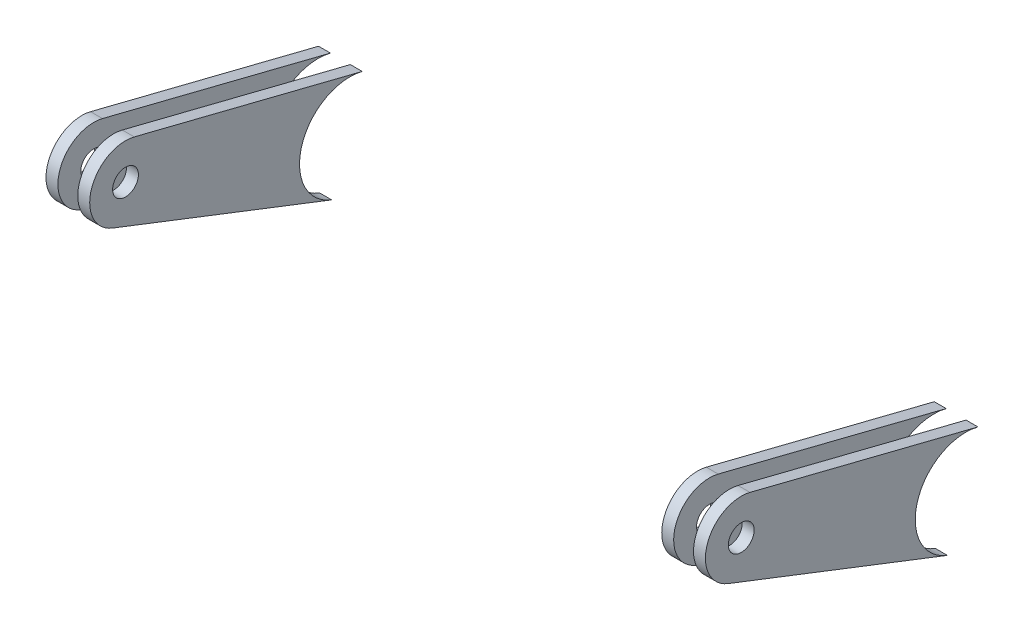
ISO-10303-21;
HEADER;
FILE_DESCRIPTION(('STEP AP214'),'2;1');
FILE_NAME('part.step','',(''),(''),'','','');
FILE_SCHEMA(('AUTOMOTIVE_DESIGN { 1 0 10303 214 1 1 1 1 }'));
ENDSEC;
DATA;
#1=APPLICATION_CONTEXT('core data for automotive mechanical design processes');
#2=APPLICATION_PROTOCOL_DEFINITION('international standard','automotive_design',2000,#1);
#3=PRODUCT_CONTEXT('',#1,'mechanical');
#4=PRODUCT('Part','Part','',(#3));
#5=PRODUCT_RELATED_PRODUCT_CATEGORY('part','',(#4));
#6=PRODUCT_DEFINITION_FORMATION('','',#4);
#7=PRODUCT_DEFINITION_CONTEXT('part definition',#1,'design');
#8=PRODUCT_DEFINITION('design','',#6,#7);
#9=PRODUCT_DEFINITION_SHAPE('','',#8);
#10=(LENGTH_UNIT() NAMED_UNIT(*) SI_UNIT(.MILLI.,.METRE.));
#11=(NAMED_UNIT(*) PLANE_ANGLE_UNIT() SI_UNIT($,.RADIAN.));
#12=(NAMED_UNIT(*) SI_UNIT($,.STERADIAN.) SOLID_ANGLE_UNIT());
#13=UNCERTAINTY_MEASURE_WITH_UNIT(LENGTH_MEASURE(1.E-05),#10,'distance_accuracy_value','');
#14=(GEOMETRIC_REPRESENTATION_CONTEXT(3) GLOBAL_UNCERTAINTY_ASSIGNED_CONTEXT((#13)) GLOBAL_UNIT_ASSIGNED_CONTEXT((#10,
#11,#12)) REPRESENTATION_CONTEXT('',''));
#15=CARTESIAN_POINT('',(0.,0.,0.));
#16=DIRECTION('',(0.,0.,1.));
#17=DIRECTION('',(1.,0.,0.));
#18=AXIS2_PLACEMENT_3D('',#15,#16,#17);
#19=CARTESIAN_POINT('',(-87.9999999999965,265.000000000002,-2250.));
#20=DIRECTION('',(-1.,0.,0.));
#21=DIRECTION('',(0.,-1.,0.));
#22=AXIS2_PLACEMENT_3D('',#19,#20,#21);
#23=PLANE('',#22);
#24=CARTESIAN_POINT('',(-87.9999999999966,283.000000000003,-2193.5));
#25=DIRECTION('',(1.,0.,0.));
#26=DIRECTION('',(0.,1.,0.));
#27=AXIS2_PLACEMENT_3D('',#24,#25,#26);
#28=CIRCLE('',#27,3.25000000000017);
#29=CARTESIAN_POINT('',(-87.9999999999966,286.250000000003,-2193.5));
#30=VERTEX_POINT('',#29);
#31=EDGE_CURVE('E118',#30,#30,#28,.T.);
#32=ORIENTED_EDGE('',*,*,#31,.T.);
#33=EDGE_LOOP('',(#32));
#34=FACE_BOUND('',#33,.T.);
#35=DIRECTION('',(0.,0.243792880775434,0.969827320342758));
#36=VECTOR('',#35,1.);
#37=CARTESIAN_POINT('',(-87.9999999999965,277.316806968356,-2253.09616958585));
#38=LINE('',#37,#36);
#39=CARTESIAN_POINT('',(-87.9999999999965,277.316806968356,-2253.09616958585));
#40=VERTEX_POINT('',#39);
#41=CARTESIAN_POINT('',(-87.9999999999966,291.745326695139,-2195.69837938529));
#42=VERTEX_POINT('',#41);
#43=EDGE_CURVE('E93',#40,#42,#38,.T.);
#44=ORIENTED_EDGE('',*,*,#43,.F.);
#45=CARTESIAN_POINT('',(-87.9999999999965,265.000000000002,-2250.));
#46=DIRECTION('',(-1.,0.,0.));
#47=DIRECTION('',(0.,-1.,0.));
#48=AXIS2_PLACEMENT_3D('',#45,#46,#47);
#49=CIRCLE('',#48,12.7);
#50=CARTESIAN_POINT('',(-87.9999999999966,253.162021891337,-2245.4008398268));
#51=VERTEX_POINT('',#50);
#52=EDGE_CURVE('E49',#40,#51,#49,.F.);
#53=ORIENTED_EDGE('',*,*,#52,.T.);
#54=DIRECTION('',(0.,-0.362138596315164,-0.932124260524788));
#55=VECTOR('',#54,1.);
#56=CARTESIAN_POINT('',(-87.9999999999966,253.162021891337,-2245.4008398268));
#57=LINE('',#56,#55);
#58=CARTESIAN_POINT('',(-87.9999999999966,274.594657102599,-2190.23444924961));
#59=VERTEX_POINT('',#58);
#60=EDGE_CURVE('E106',#59,#51,#57,.T.);
#61=ORIENTED_EDGE('',*,*,#60,.F.);
#62=CARTESIAN_POINT('',(-87.9999999999966,283.000000000003,-2193.5));
#63=DIRECTION('',(1.,0.,0.));
#64=DIRECTION('',(0.,1.,0.));
#65=AXIS2_PLACEMENT_3D('',#62,#63,#64);
#66=CIRCLE('',#65,9.01740599764169);
#67=EDGE_CURVE('E88',#42,#59,#66,.T.);
#68=ORIENTED_EDGE('',*,*,#67,.F.);
#69=EDGE_LOOP('',(#44,#53,#61,#68));
#70=FACE_BOUND('',#69,.T.);
#71=ADVANCED_FACE('F46',(#34,#70),#23,.T.);
#72=CARTESIAN_POINT('',(-84.9999999999965,265.000000000002,-2250.));
#73=DIRECTION('',(-1.,0.,0.));
#74=DIRECTION('',(0.,-1.,0.));
#75=AXIS2_PLACEMENT_3D('',#72,#73,#74);
#76=PLANE('',#75);
#77=CARTESIAN_POINT('',(-84.9999999999966,283.000000000003,-2193.5));
#78=DIRECTION('',(1.,0.,0.));
#79=DIRECTION('',(0.,1.,0.));
#80=AXIS2_PLACEMENT_3D('',#77,#78,#79);
#81=CIRCLE('',#80,3.25000000000017);
#82=CARTESIAN_POINT('',(-84.9999999999966,286.250000000003,-2193.5));
#83=VERTEX_POINT('',#82);
#84=EDGE_CURVE('E116',#83,#83,#81,.T.);
#85=ORIENTED_EDGE('',*,*,#84,.F.);
#86=EDGE_LOOP('',(#85));
#87=FACE_BOUND('',#86,.T.);
#88=CARTESIAN_POINT('',(-84.9999999999965,265.000000000002,-2250.));
#89=DIRECTION('',(-1.,0.,0.));
#90=DIRECTION('',(0.,-1.,0.));
#91=AXIS2_PLACEMENT_3D('',#88,#89,#90);
#92=CIRCLE('',#91,12.7);
#93=CARTESIAN_POINT('',(-84.9999999999965,277.316806968356,-2253.09616958585));
#94=VERTEX_POINT('',#93);
#95=CARTESIAN_POINT('',(-84.9999999999966,253.162021891337,-2245.4008398268));
#96=VERTEX_POINT('',#95);
#97=EDGE_CURVE('E12',#94,#96,#92,.F.);
#98=ORIENTED_EDGE('',*,*,#97,.F.);
#99=DIRECTION('',(0.,0.243792880775434,0.969827320342758));
#100=VECTOR('',#99,1.);
#101=CARTESIAN_POINT('',(-84.9999999999965,277.316806968356,-2253.09616958585));
#102=LINE('',#101,#100);
#103=CARTESIAN_POINT('',(-84.9999999999966,291.745326695139,-2195.69837938529));
#104=VERTEX_POINT('',#103);
#105=EDGE_CURVE('E101',#94,#104,#102,.T.);
#106=ORIENTED_EDGE('',*,*,#105,.T.);
#107=CARTESIAN_POINT('',(-84.9999999999966,283.000000000003,-2193.5));
#108=DIRECTION('',(1.,0.,0.));
#109=DIRECTION('',(0.,1.,0.));
#110=AXIS2_PLACEMENT_3D('',#107,#108,#109);
#111=CIRCLE('',#110,9.01740599764169);
#112=CARTESIAN_POINT('',(-84.9999999999966,274.594657102599,-2190.23444924961));
#113=VERTEX_POINT('',#112);
#114=EDGE_CURVE('E85',#104,#113,#111,.T.);
#115=ORIENTED_EDGE('',*,*,#114,.T.);
#116=DIRECTION('',(0.,-0.362138596315164,-0.932124260524788));
#117=VECTOR('',#116,1.);
#118=CARTESIAN_POINT('',(-84.9999999999966,253.162021891337,-2245.4008398268));
#119=LINE('',#118,#117);
#120=EDGE_CURVE('E99',#113,#96,#119,.T.);
#121=ORIENTED_EDGE('',*,*,#120,.T.);
#122=EDGE_LOOP('',(#98,#106,#115,#121));
#123=FACE_BOUND('',#122,.T.);
#124=ADVANCED_FACE('F98',(#87,#123),#76,.F.);
#125=CARTESIAN_POINT('',(-87.9999999999966,253.162021891337,-2245.4008398268));
#126=DIRECTION('',(0.,-0.932124260524788,0.362138596315164));
#127=DIRECTION('',(0.,-0.362138596315164,-0.932124260524788));
#128=AXIS2_PLACEMENT_3D('',#125,#126,#127);
#129=PLANE('',#128);
#130=ORIENTED_EDGE('',*,*,#120,.F.);
#131=DIRECTION('',(1.,0.,0.));
#132=VECTOR('',#131,1.);
#133=CARTESIAN_POINT('',(-87.9999999999966,274.594657102599,-2190.23444924961));
#134=LINE('',#133,#132);
#135=EDGE_CURVE('E82',#59,#113,#134,.T.);
#136=ORIENTED_EDGE('',*,*,#135,.F.);
#137=ORIENTED_EDGE('',*,*,#60,.T.);
#138=DIRECTION('',(1.,0.,0.));
#139=VECTOR('',#138,1.);
#140=CARTESIAN_POINT('',(-87.9999999999966,253.162021891337,-2245.4008398268));
#141=LINE('',#140,#139);
#142=EDGE_CURVE('E105',#51,#96,#141,.T.);
#143=ORIENTED_EDGE('',*,*,#142,.T.);
#144=EDGE_LOOP('',(#130,#136,#137,#143));
#145=FACE_BOUND('',#144,.T.);
#146=ADVANCED_FACE('F104',(#145),#129,.T.);
#147=CARTESIAN_POINT('',(-87.9999999999966,283.000000000003,-2193.5));
#148=DIRECTION('',(1.,0.,0.));
#149=DIRECTION('',(0.,1.,0.));
#150=AXIS2_PLACEMENT_3D('',#147,#148,#149);
#151=CYLINDRICAL_SURFACE('',#150,9.01740599764169);
#152=ORIENTED_EDGE('',*,*,#114,.F.);
#153=DIRECTION('',(1.,0.,0.));
#154=VECTOR('',#153,1.);
#155=CARTESIAN_POINT('',(-87.9999999999966,291.745326695139,-2195.69837938529));
#156=LINE('',#155,#154);
#157=EDGE_CURVE('E115',#42,#104,#156,.T.);
#158=ORIENTED_EDGE('',*,*,#157,.F.);
#159=ORIENTED_EDGE('',*,*,#67,.T.);
#160=ORIENTED_EDGE('',*,*,#135,.T.);
#161=EDGE_LOOP('',(#152,#158,#159,#160));
#162=FACE_BOUND('',#161,.T.);
#163=ADVANCED_FACE('F84',(#162),#151,.T.);
#164=CARTESIAN_POINT('',(-87.9999999999965,277.316806968356,-2253.09616958585));
#165=DIRECTION('',(0.,0.969827320342758,-0.243792880775434));
#166=DIRECTION('',(0.,0.243792880775434,0.969827320342758));
#167=AXIS2_PLACEMENT_3D('',#164,#165,#166);
#168=PLANE('',#167);
#169=ORIENTED_EDGE('',*,*,#105,.F.);
#170=DIRECTION('',(1.,0.,0.));
#171=VECTOR('',#170,1.);
#172=CARTESIAN_POINT('',(-87.9999999999965,277.316806968356,-2253.09616958585));
#173=LINE('',#172,#171);
#174=EDGE_CURVE('E55',#40,#94,#173,.T.);
#175=ORIENTED_EDGE('',*,*,#174,.F.);
#176=ORIENTED_EDGE('',*,*,#43,.T.);
#177=ORIENTED_EDGE('',*,*,#157,.T.);
#178=EDGE_LOOP('',(#169,#175,#176,#177));
#179=FACE_BOUND('',#178,.T.);
#180=ADVANCED_FACE('F125',(#179),#168,.T.);
#181=CARTESIAN_POINT('',(-87.9999999999966,283.000000000003,-2193.5));
#182=DIRECTION('',(1.,0.,0.));
#183=DIRECTION('',(0.,1.,0.));
#184=AXIS2_PLACEMENT_3D('',#181,#182,#183);
#185=CYLINDRICAL_SURFACE('',#184,3.25000000000017);
#186=ORIENTED_EDGE('',*,*,#31,.F.);
#187=EDGE_LOOP('',(#186));
#188=FACE_BOUND('',#187,.T.);
#189=ORIENTED_EDGE('',*,*,#84,.T.);
#190=EDGE_LOOP('',(#189));
#191=FACE_BOUND('',#190,.T.);
#192=ADVANCED_FACE('F130',(#188,#191),#185,.F.);
#193=CARTESIAN_POINT('',(-220.,265.000000000002,-2250.));
#194=DIRECTION('',(1.,0.,0.));
#195=DIRECTION('',(0.,0.,-1.));
#196=AXIS2_PLACEMENT_3D('',#193,#194,#195);
#197=CYLINDRICAL_SURFACE('',#196,12.7);
#198=ORIENTED_EDGE('',*,*,#174,.T.);
#199=ORIENTED_EDGE('',*,*,#97,.T.);
#200=ORIENTED_EDGE('',*,*,#142,.F.);
#201=ORIENTED_EDGE('',*,*,#52,.F.);
#202=EDGE_LOOP('',(#198,#199,#200,#201));
#203=FACE_BOUND('',#202,.T.);
#204=ADVANCED_FACE('F128',(#203),#197,.F.);
#205=CLOSED_SHELL('',(#71,#124,#146,#163,#180,#192,#204));
#206=MANIFOLD_SOLID_BREP('B2',#205);
#207=CARTESIAN_POINT('',(-76.9999999999965,265.000000000002,-2250.));
#208=DIRECTION('',(-1.,0.,0.));
#209=DIRECTION('',(0.,-1.,0.));
#210=AXIS2_PLACEMENT_3D('',#207,#208,#209);
#211=PLANE('',#210);
#212=CARTESIAN_POINT('',(-76.9999999999966,283.000000000003,-2193.5));
#213=DIRECTION('',(1.,0.,0.));
#214=DIRECTION('',(0.,1.,0.));
#215=AXIS2_PLACEMENT_3D('',#212,#213,#214);
#216=CIRCLE('',#215,3.25000000000017);
#217=CARTESIAN_POINT('',(-76.9999999999966,286.250000000003,-2193.5));
#218=VERTEX_POINT('',#217);
#219=EDGE_CURVE('E260',#218,#218,#216,.T.);
#220=ORIENTED_EDGE('',*,*,#219,.F.);
#221=EDGE_LOOP('',(#220));
#222=FACE_BOUND('',#221,.T.);
#223=CARTESIAN_POINT('',(-76.9999999999965,265.000000000002,-2250.));
#224=DIRECTION('',(-1.,0.,0.));
#225=DIRECTION('',(0.,-1.,0.));
#226=AXIS2_PLACEMENT_3D('',#223,#224,#225);
#227=CIRCLE('',#226,12.7);
#228=CARTESIAN_POINT('',(-76.9999999999965,277.316806968356,-2253.09616958585));
#229=VERTEX_POINT('',#228);
#230=CARTESIAN_POINT('',(-76.9999999999966,253.162021891337,-2245.4008398268));
#231=VERTEX_POINT('',#230);
#232=EDGE_CURVE('E212',#229,#231,#227,.F.);
#233=ORIENTED_EDGE('',*,*,#232,.F.);
#234=DIRECTION('',(0.,0.243792880775434,0.969827320342758));
#235=VECTOR('',#234,1.);
#236=CARTESIAN_POINT('',(-76.9999999999965,277.316806968356,-2253.09616958585));
#237=LINE('',#236,#235);
#238=CARTESIAN_POINT('',(-76.9999999999966,291.745326695138,-2195.69837938529));
#239=VERTEX_POINT('',#238);
#240=EDGE_CURVE('E273',#229,#239,#237,.T.);
#241=ORIENTED_EDGE('',*,*,#240,.T.);
#242=CARTESIAN_POINT('',(-76.9999999999966,283.000000000003,-2193.5));
#243=DIRECTION('',(1.,0.,0.));
#244=DIRECTION('',(0.,1.,0.));
#245=AXIS2_PLACEMENT_3D('',#242,#243,#244);
#246=CIRCLE('',#245,9.01740599764169);
#247=CARTESIAN_POINT('',(-76.9999999999966,274.594657102599,-2190.23444924961));
#248=VERTEX_POINT('',#247);
#249=EDGE_CURVE('E271',#239,#248,#246,.T.);
#250=ORIENTED_EDGE('',*,*,#249,.T.);
#251=DIRECTION('',(0.,-0.362138596315164,-0.932124260524788));
#252=VECTOR('',#251,1.);
#253=CARTESIAN_POINT('',(-76.9999999999966,253.162021891337,-2245.4008398268));
#254=LINE('',#253,#252);
#255=EDGE_CURVE('E259',#248,#231,#254,.T.);
#256=ORIENTED_EDGE('',*,*,#255,.T.);
#257=EDGE_LOOP('',(#233,#241,#250,#256));
#258=FACE_BOUND('',#257,.T.);
#259=ADVANCED_FACE('F203',(#222,#258),#211,.F.);
#260=CARTESIAN_POINT('',(-79.9999999999965,265.000000000002,-2250.));
#261=DIRECTION('',(-1.,0.,0.));
#262=DIRECTION('',(0.,-1.,0.));
#263=AXIS2_PLACEMENT_3D('',#260,#261,#262);
#264=PLANE('',#263);
#265=CARTESIAN_POINT('',(-79.9999999999966,283.000000000003,-2193.5));
#266=DIRECTION('',(1.,0.,0.));
#267=DIRECTION('',(0.,1.,0.));
#268=AXIS2_PLACEMENT_3D('',#265,#266,#267);
#269=CIRCLE('',#268,3.25000000000017);
#270=CARTESIAN_POINT('',(-79.9999999999966,286.250000000003,-2193.5));
#271=VERTEX_POINT('',#270);
#272=EDGE_CURVE('E270',#271,#271,#269,.T.);
#273=ORIENTED_EDGE('',*,*,#272,.T.);
#274=EDGE_LOOP('',(#273));
#275=FACE_BOUND('',#274,.T.);
#276=DIRECTION('',(0.,0.243792880775434,0.969827320342758));
#277=VECTOR('',#276,1.);
#278=CARTESIAN_POINT('',(-79.9999999999965,277.316806968356,-2253.09616958585));
#279=LINE('',#278,#277);
#280=CARTESIAN_POINT('',(-79.9999999999965,277.316806968356,-2253.09616958585));
#281=VERTEX_POINT('',#280);
#282=CARTESIAN_POINT('',(-79.9999999999966,291.745326695138,-2195.69837938529));
#283=VERTEX_POINT('',#282);
#284=EDGE_CURVE('E267',#281,#283,#279,.T.);
#285=ORIENTED_EDGE('',*,*,#284,.F.);
#286=CARTESIAN_POINT('',(-79.9999999999965,265.000000000002,-2250.));
#287=DIRECTION('',(-1.,0.,0.));
#288=DIRECTION('',(0.,-1.,0.));
#289=AXIS2_PLACEMENT_3D('',#286,#287,#288);
#290=CIRCLE('',#289,12.7);
#291=CARTESIAN_POINT('',(-79.9999999999966,253.162021891337,-2245.4008398268));
#292=VERTEX_POINT('',#291);
#293=EDGE_CURVE('E206',#281,#292,#290,.F.);
#294=ORIENTED_EDGE('',*,*,#293,.T.);
#295=DIRECTION('',(0.,-0.362138596315164,-0.932124260524788));
#296=VECTOR('',#295,1.);
#297=CARTESIAN_POINT('',(-79.9999999999966,253.162021891337,-2245.4008398268));
#298=LINE('',#297,#296);
#299=CARTESIAN_POINT('',(-79.9999999999966,274.594657102599,-2190.23444924961));
#300=VERTEX_POINT('',#299);
#301=EDGE_CURVE('E257',#300,#292,#298,.T.);
#302=ORIENTED_EDGE('',*,*,#301,.F.);
#303=CARTESIAN_POINT('',(-79.9999999999966,283.000000000003,-2193.5));
#304=DIRECTION('',(1.,0.,0.));
#305=DIRECTION('',(0.,1.,0.));
#306=AXIS2_PLACEMENT_3D('',#303,#304,#305);
#307=CIRCLE('',#306,9.01740599764169);
#308=EDGE_CURVE('E241',#283,#300,#307,.T.);
#309=ORIENTED_EDGE('',*,*,#308,.F.);
#310=EDGE_LOOP('',(#285,#294,#302,#309));
#311=FACE_BOUND('',#310,.T.);
#312=ADVANCED_FACE('F263',(#275,#311),#264,.T.);
#313=CARTESIAN_POINT('',(-76.9999999999965,277.316806968356,-2253.09616958585));
#314=DIRECTION('',(0.,-0.969827320342758,0.243792880775434));
#315=DIRECTION('',(0.,-0.243792880775434,-0.969827320342758));
#316=AXIS2_PLACEMENT_3D('',#313,#314,#315);
#317=PLANE('',#316);
#318=ORIENTED_EDGE('',*,*,#284,.T.);
#319=DIRECTION('',(-1.,0.,0.));
#320=VECTOR('',#319,1.);
#321=CARTESIAN_POINT('',(-76.9999999999966,291.745326695138,-2195.69837938529));
#322=LINE('',#321,#320);
#323=EDGE_CURVE('E248',#239,#283,#322,.T.);
#324=ORIENTED_EDGE('',*,*,#323,.F.);
#325=ORIENTED_EDGE('',*,*,#240,.F.);
#326=DIRECTION('',(-1.,0.,0.));
#327=VECTOR('',#326,1.);
#328=CARTESIAN_POINT('',(-76.9999999999965,277.316806968356,-2253.09616958585));
#329=LINE('',#328,#327);
#330=EDGE_CURVE('E220',#229,#281,#329,.T.);
#331=ORIENTED_EDGE('',*,*,#330,.T.);
#332=EDGE_LOOP('',(#318,#324,#325,#331));
#333=FACE_BOUND('',#332,.T.);
#334=ADVANCED_FACE('F282',(#333),#317,.F.);
#335=CARTESIAN_POINT('',(-76.9999999999966,283.000000000003,-2193.5));
#336=DIRECTION('',(-1.,0.,0.));
#337=DIRECTION('',(0.,-1.,0.));
#338=AXIS2_PLACEMENT_3D('',#335,#336,#337);
#339=CYLINDRICAL_SURFACE('',#338,9.01740599764169);
#340=ORIENTED_EDGE('',*,*,#308,.T.);
#341=DIRECTION('',(-1.,0.,0.));
#342=VECTOR('',#341,1.);
#343=CARTESIAN_POINT('',(-76.9999999999966,274.594657102599,-2190.23444924961));
#344=LINE('',#343,#342);
#345=EDGE_CURVE('E245',#248,#300,#344,.T.);
#346=ORIENTED_EDGE('',*,*,#345,.F.);
#347=ORIENTED_EDGE('',*,*,#249,.F.);
#348=ORIENTED_EDGE('',*,*,#323,.T.);
#349=EDGE_LOOP('',(#340,#346,#347,#348));
#350=FACE_BOUND('',#349,.T.);
#351=ADVANCED_FACE('F243',(#350),#339,.T.);
#352=CARTESIAN_POINT('',(-76.9999999999966,253.162021891337,-2245.4008398268));
#353=DIRECTION('',(0.,0.932124260524788,-0.362138596315164));
#354=DIRECTION('',(0.,0.362138596315164,0.932124260524788));
#355=AXIS2_PLACEMENT_3D('',#352,#353,#354);
#356=PLANE('',#355);
#357=ORIENTED_EDGE('',*,*,#301,.T.);
#358=DIRECTION('',(-1.,0.,0.));
#359=VECTOR('',#358,1.);
#360=CARTESIAN_POINT('',(-76.9999999999966,253.162021891337,-2245.4008398268));
#361=LINE('',#360,#359);
#362=EDGE_CURVE('E44',#231,#292,#361,.T.);
#363=ORIENTED_EDGE('',*,*,#362,.F.);
#364=ORIENTED_EDGE('',*,*,#255,.F.);
#365=ORIENTED_EDGE('',*,*,#345,.T.);
#366=EDGE_LOOP('',(#357,#363,#364,#365));
#367=FACE_BOUND('',#366,.T.);
#368=ADVANCED_FACE('F255',(#367),#356,.F.);
#369=CARTESIAN_POINT('',(-76.9999999999966,283.000000000003,-2193.5));
#370=DIRECTION('',(-1.,0.,0.));
#371=DIRECTION('',(0.,-1.,0.));
#372=AXIS2_PLACEMENT_3D('',#369,#370,#371);
#373=CYLINDRICAL_SURFACE('',#372,3.25000000000017);
#374=ORIENTED_EDGE('',*,*,#219,.T.);
#375=EDGE_LOOP('',(#374));
#376=FACE_BOUND('',#375,.T.);
#377=ORIENTED_EDGE('',*,*,#272,.F.);
#378=EDGE_LOOP('',(#377));
#379=FACE_BOUND('',#378,.T.);
#380=ADVANCED_FACE('F298',(#376,#379),#373,.F.);
#381=CARTESIAN_POINT('',(-220.,265.000000000002,-2250.));
#382=DIRECTION('',(1.,0.,0.));
#383=DIRECTION('',(0.,0.,-1.));
#384=AXIS2_PLACEMENT_3D('',#381,#382,#383);
#385=CYLINDRICAL_SURFACE('',#384,12.7);
#386=ORIENTED_EDGE('',*,*,#232,.T.);
#387=ORIENTED_EDGE('',*,*,#362,.T.);
#388=ORIENTED_EDGE('',*,*,#293,.F.);
#389=ORIENTED_EDGE('',*,*,#330,.F.);
#390=EDGE_LOOP('',(#386,#387,#388,#389));
#391=FACE_BOUND('',#390,.T.);
#392=ADVANCED_FACE('F278',(#391),#385,.F.);
#393=CLOSED_SHELL('',(#259,#312,#334,#351,#368,#380,#392));
#394=MANIFOLD_SOLID_BREP('B6',#393);
#395=CARTESIAN_POINT('',(78.0000000000035,265.000000000001,-2250.));
#396=DIRECTION('',(-1.,0.,0.));
#397=DIRECTION('',(0.,-1.,0.));
#398=AXIS2_PLACEMENT_3D('',#395,#396,#397);
#399=PLANE('',#398);
#400=CARTESIAN_POINT('',(78.0000000000034,283.000000000003,-2193.5));
#401=DIRECTION('',(1.,0.,0.));
#402=DIRECTION('',(0.,1.,0.));
#403=AXIS2_PLACEMENT_3D('',#400,#401,#402);
#404=CIRCLE('',#403,3.25000000000017);
#405=CARTESIAN_POINT('',(78.0000000000034,286.250000000003,-2193.5));
#406=VERTEX_POINT('',#405);
#407=EDGE_CURVE('E416',#406,#406,#404,.T.);
#408=ORIENTED_EDGE('',*,*,#407,.F.);
#409=EDGE_LOOP('',(#408));
#410=FACE_BOUND('',#409,.T.);
#411=CARTESIAN_POINT('',(78.0000000000034,265.000000000002,-2250.));
#412=DIRECTION('',(-1.,0.,0.));
#413=DIRECTION('',(0.,-1.,0.));
#414=AXIS2_PLACEMENT_3D('',#411,#412,#413);
#415=CIRCLE('',#414,12.7);
#416=CARTESIAN_POINT('',(78.0000000000035,277.316806968355,-2253.09616958585));
#417=VERTEX_POINT('',#416);
#418=CARTESIAN_POINT('',(78.0000000000034,253.162021891336,-2245.4008398268));
#419=VERTEX_POINT('',#418);
#420=EDGE_CURVE('E368',#417,#419,#415,.F.);
#421=ORIENTED_EDGE('',*,*,#420,.F.);
#422=DIRECTION('',(0.,0.243792880775434,0.969827320342758));
#423=VECTOR('',#422,1.);
#424=CARTESIAN_POINT('',(78.0000000000035,277.316806968355,-2253.09616958585));
#425=LINE('',#424,#423);
#426=CARTESIAN_POINT('',(78.0000000000034,291.745326695138,-2195.69837938529));
#427=VERTEX_POINT('',#426);
#428=EDGE_CURVE('E429',#417,#427,#425,.T.);
#429=ORIENTED_EDGE('',*,*,#428,.T.);
#430=CARTESIAN_POINT('',(78.0000000000034,283.000000000003,-2193.5));
#431=DIRECTION('',(1.,0.,0.));
#432=DIRECTION('',(0.,1.,0.));
#433=AXIS2_PLACEMENT_3D('',#430,#431,#432);
#434=CIRCLE('',#433,9.01740599764169);
#435=CARTESIAN_POINT('',(78.0000000000034,274.594657102599,-2190.23444924961));
#436=VERTEX_POINT('',#435);
#437=EDGE_CURVE('E427',#427,#436,#434,.T.);
#438=ORIENTED_EDGE('',*,*,#437,.T.);
#439=DIRECTION('',(0.,-0.362138596315164,-0.932124260524788));
#440=VECTOR('',#439,1.);
#441=CARTESIAN_POINT('',(78.0000000000034,253.162021891336,-2245.4008398268));
#442=LINE('',#441,#440);
#443=EDGE_CURVE('E415',#436,#419,#442,.T.);
#444=ORIENTED_EDGE('',*,*,#443,.T.);
#445=EDGE_LOOP('',(#421,#429,#438,#444));
#446=FACE_BOUND('',#445,.T.);
#447=ADVANCED_FACE('F359',(#410,#446),#399,.F.);
#448=CARTESIAN_POINT('',(75.0000000000035,265.000000000001,-2250.));
#449=DIRECTION('',(-1.,0.,0.));
#450=DIRECTION('',(0.,-1.,0.));
#451=AXIS2_PLACEMENT_3D('',#448,#449,#450);
#452=PLANE('',#451);
#453=CARTESIAN_POINT('',(75.0000000000034,283.000000000003,-2193.5));
#454=DIRECTION('',(1.,0.,0.));
#455=DIRECTION('',(0.,1.,0.));
#456=AXIS2_PLACEMENT_3D('',#453,#454,#455);
#457=CIRCLE('',#456,3.25000000000017);
#458=CARTESIAN_POINT('',(75.0000000000034,286.250000000003,-2193.5));
#459=VERTEX_POINT('',#458);
#460=EDGE_CURVE('E426',#459,#459,#457,.T.);
#461=ORIENTED_EDGE('',*,*,#460,.T.);
#462=EDGE_LOOP('',(#461));
#463=FACE_BOUND('',#462,.T.);
#464=DIRECTION('',(0.,0.243792880775434,0.969827320342758));
#465=VECTOR('',#464,1.);
#466=CARTESIAN_POINT('',(75.0000000000035,277.316806968355,-2253.09616958585));
#467=LINE('',#466,#465);
#468=CARTESIAN_POINT('',(75.0000000000035,277.316806968355,-2253.09616958585));
#469=VERTEX_POINT('',#468);
#470=CARTESIAN_POINT('',(75.0000000000034,291.745326695138,-2195.69837938529));
#471=VERTEX_POINT('',#470);
#472=EDGE_CURVE('E423',#469,#471,#467,.T.);
#473=ORIENTED_EDGE('',*,*,#472,.F.);
#474=CARTESIAN_POINT('',(75.0000000000034,265.000000000002,-2250.));
#475=DIRECTION('',(-1.,0.,0.));
#476=DIRECTION('',(0.,-1.,0.));
#477=AXIS2_PLACEMENT_3D('',#474,#475,#476);
#478=CIRCLE('',#477,12.7);
#479=CARTESIAN_POINT('',(75.0000000000034,253.162021891337,-2245.4008398268));
#480=VERTEX_POINT('',#479);
#481=EDGE_CURVE('E362',#469,#480,#478,.F.);
#482=ORIENTED_EDGE('',*,*,#481,.T.);
#483=DIRECTION('',(0.,-0.362138596315164,-0.932124260524788));
#484=VECTOR('',#483,1.);
#485=CARTESIAN_POINT('',(75.0000000000034,253.162021891336,-2245.4008398268));
#486=LINE('',#485,#484);
#487=CARTESIAN_POINT('',(75.0000000000034,274.594657102599,-2190.23444924961));
#488=VERTEX_POINT('',#487);
#489=EDGE_CURVE('E413',#488,#480,#486,.T.);
#490=ORIENTED_EDGE('',*,*,#489,.F.);
#491=CARTESIAN_POINT('',(75.0000000000034,283.000000000003,-2193.5));
#492=DIRECTION('',(1.,0.,0.));
#493=DIRECTION('',(0.,1.,0.));
#494=AXIS2_PLACEMENT_3D('',#491,#492,#493);
#495=CIRCLE('',#494,9.01740599764169);
#496=EDGE_CURVE('E397',#471,#488,#495,.T.);
#497=ORIENTED_EDGE('',*,*,#496,.F.);
#498=EDGE_LOOP('',(#473,#482,#490,#497));
#499=FACE_BOUND('',#498,.T.);
#500=ADVANCED_FACE('F419',(#463,#499),#452,.T.);
#501=CARTESIAN_POINT('',(78.0000000000035,277.316806968355,-2253.09616958585));
#502=DIRECTION('',(0.,-0.969827320342758,0.243792880775434));
#503=DIRECTION('',(0.,-0.243792880775434,-0.969827320342758));
#504=AXIS2_PLACEMENT_3D('',#501,#502,#503);
#505=PLANE('',#504);
#506=ORIENTED_EDGE('',*,*,#472,.T.);
#507=DIRECTION('',(-1.,0.,0.));
#508=VECTOR('',#507,1.);
#509=CARTESIAN_POINT('',(78.0000000000034,291.745326695138,-2195.69837938529));
#510=LINE('',#509,#508);
#511=EDGE_CURVE('E404',#427,#471,#510,.T.);
#512=ORIENTED_EDGE('',*,*,#511,.F.);
#513=ORIENTED_EDGE('',*,*,#428,.F.);
#514=DIRECTION('',(-1.,0.,0.));
#515=VECTOR('',#514,1.);
#516=CARTESIAN_POINT('',(78.0000000000035,277.316806968355,-2253.09616958585));
#517=LINE('',#516,#515);
#518=EDGE_CURVE('E376',#417,#469,#517,.T.);
#519=ORIENTED_EDGE('',*,*,#518,.T.);
#520=EDGE_LOOP('',(#506,#512,#513,#519));
#521=FACE_BOUND('',#520,.T.);
#522=ADVANCED_FACE('F438',(#521),#505,.F.);
#523=CARTESIAN_POINT('',(78.0000000000034,283.000000000003,-2193.5));
#524=DIRECTION('',(-1.,0.,0.));
#525=DIRECTION('',(0.,-1.,0.));
#526=AXIS2_PLACEMENT_3D('',#523,#524,#525);
#527=CYLINDRICAL_SURFACE('',#526,9.01740599764169);
#528=ORIENTED_EDGE('',*,*,#496,.T.);
#529=DIRECTION('',(-1.,0.,0.));
#530=VECTOR('',#529,1.);
#531=CARTESIAN_POINT('',(78.0000000000034,274.594657102599,-2190.23444924961));
#532=LINE('',#531,#530);
#533=EDGE_CURVE('E401',#436,#488,#532,.T.);
#534=ORIENTED_EDGE('',*,*,#533,.F.);
#535=ORIENTED_EDGE('',*,*,#437,.F.);
#536=ORIENTED_EDGE('',*,*,#511,.T.);
#537=EDGE_LOOP('',(#528,#534,#535,#536));
#538=FACE_BOUND('',#537,.T.);
#539=ADVANCED_FACE('F399',(#538),#527,.T.);
#540=CARTESIAN_POINT('',(78.0000000000034,253.162021891336,-2245.4008398268));
#541=DIRECTION('',(0.,0.932124260524788,-0.362138596315164));
#542=DIRECTION('',(0.,0.362138596315164,0.932124260524788));
#543=AXIS2_PLACEMENT_3D('',#540,#541,#542);
#544=PLANE('',#543);
#545=ORIENTED_EDGE('',*,*,#489,.T.);
#546=DIRECTION('',(-1.,0.,0.));
#547=VECTOR('',#546,1.);
#548=CARTESIAN_POINT('',(78.0000000000034,253.162021891336,-2245.4008398268));
#549=LINE('',#548,#547);
#550=EDGE_CURVE('E201',#419,#480,#549,.T.);
#551=ORIENTED_EDGE('',*,*,#550,.F.);
#552=ORIENTED_EDGE('',*,*,#443,.F.);
#553=ORIENTED_EDGE('',*,*,#533,.T.);
#554=EDGE_LOOP('',(#545,#551,#552,#553));
#555=FACE_BOUND('',#554,.T.);
#556=ADVANCED_FACE('F411',(#555),#544,.F.);
#557=CARTESIAN_POINT('',(78.0000000000034,283.000000000003,-2193.5));
#558=DIRECTION('',(-1.,0.,0.));
#559=DIRECTION('',(0.,-1.,0.));
#560=AXIS2_PLACEMENT_3D('',#557,#558,#559);
#561=CYLINDRICAL_SURFACE('',#560,3.25000000000017);
#562=ORIENTED_EDGE('',*,*,#407,.T.);
#563=EDGE_LOOP('',(#562));
#564=FACE_BOUND('',#563,.T.);
#565=ORIENTED_EDGE('',*,*,#460,.F.);
#566=EDGE_LOOP('',(#565));
#567=FACE_BOUND('',#566,.T.);
#568=ADVANCED_FACE('F454',(#564,#567),#561,.F.);
#569=CARTESIAN_POINT('',(-220.,265.000000000002,-2250.));
#570=DIRECTION('',(1.,0.,0.));
#571=DIRECTION('',(0.,0.,-1.));
#572=AXIS2_PLACEMENT_3D('',#569,#570,#571);
#573=CYLINDRICAL_SURFACE('',#572,12.7);
#574=ORIENTED_EDGE('',*,*,#420,.T.);
#575=ORIENTED_EDGE('',*,*,#550,.T.);
#576=ORIENTED_EDGE('',*,*,#481,.F.);
#577=ORIENTED_EDGE('',*,*,#518,.F.);
#578=EDGE_LOOP('',(#574,#575,#576,#577));
#579=FACE_BOUND('',#578,.T.);
#580=ADVANCED_FACE('F434',(#579),#573,.F.);
#581=CLOSED_SHELL('',(#447,#500,#522,#539,#556,#568,#580));
#582=MANIFOLD_SOLID_BREP('B38',#581);
#583=CARTESIAN_POINT('',(67.0000000000034,265.000000000001,-2250.));
#584=DIRECTION('',(-1.,0.,0.));
#585=DIRECTION('',(0.,-1.,0.));
#586=AXIS2_PLACEMENT_3D('',#583,#584,#585);
#587=PLANE('',#586);
#588=CARTESIAN_POINT('',(67.0000000000034,283.000000000003,-2193.5));
#589=DIRECTION('',(1.,0.,0.));
#590=DIRECTION('',(0.,1.,0.));
#591=AXIS2_PLACEMENT_3D('',#588,#589,#590);
#592=CIRCLE('',#591,3.25000000000017);
#593=CARTESIAN_POINT('',(67.0000000000034,286.250000000003,-2193.5));
#594=VERTEX_POINT('',#593);
#595=EDGE_CURVE('E578',#594,#594,#592,.T.);
#596=ORIENTED_EDGE('',*,*,#595,.T.);
#597=EDGE_LOOP('',(#596));
#598=FACE_BOUND('',#597,.T.);
#599=DIRECTION('',(0.,0.243792880775434,0.969827320342758));
#600=VECTOR('',#599,1.);
#601=CARTESIAN_POINT('',(67.0000000000035,277.316806968355,-2253.09616958585));
#602=LINE('',#601,#600);
#603=CARTESIAN_POINT('',(67.0000000000035,277.316806968356,-2253.09616958585));
#604=VERTEX_POINT('',#603);
#605=CARTESIAN_POINT('',(67.0000000000034,291.745326695138,-2195.69837938529));
#606=VERTEX_POINT('',#605);
#607=EDGE_CURVE('E553',#604,#606,#602,.T.);
#608=ORIENTED_EDGE('',*,*,#607,.F.);
#609=CARTESIAN_POINT('',(67.0000000000034,265.000000000002,-2250.));
#610=DIRECTION('',(-1.,0.,0.));
#611=DIRECTION('',(0.,-1.,0.));
#612=AXIS2_PLACEMENT_3D('',#609,#610,#611);
#613=CIRCLE('',#612,12.7);
#614=CARTESIAN_POINT('',(67.0000000000034,253.162021891337,-2245.4008398268));
#615=VERTEX_POINT('',#614);
#616=EDGE_CURVE('E509',#604,#615,#613,.F.);
#617=ORIENTED_EDGE('',*,*,#616,.T.);
#618=DIRECTION('',(0.,-0.362138596315164,-0.932124260524788));
#619=VECTOR('',#618,1.);
#620=CARTESIAN_POINT('',(67.0000000000034,253.162021891336,-2245.4008398268));
#621=LINE('',#620,#619);
#622=CARTESIAN_POINT('',(67.0000000000034,274.594657102599,-2190.23444924961));
#623=VERTEX_POINT('',#622);
#624=EDGE_CURVE('E566',#623,#615,#621,.T.);
#625=ORIENTED_EDGE('',*,*,#624,.F.);
#626=CARTESIAN_POINT('',(67.0000000000034,283.000000000003,-2193.5));
#627=DIRECTION('',(1.,0.,0.));
#628=DIRECTION('',(0.,1.,0.));
#629=AXIS2_PLACEMENT_3D('',#626,#627,#628);
#630=CIRCLE('',#629,9.01740599764169);
#631=EDGE_CURVE('E548',#606,#623,#630,.T.);
#632=ORIENTED_EDGE('',*,*,#631,.F.);
#633=EDGE_LOOP('',(#608,#617,#625,#632));
#634=FACE_BOUND('',#633,.T.);
#635=ADVANCED_FACE('F506',(#598,#634),#587,.T.);
#636=CARTESIAN_POINT('',(70.0000000000035,265.000000000001,-2250.));
#637=DIRECTION('',(-1.,0.,0.));
#638=DIRECTION('',(0.,-1.,0.));
#639=AXIS2_PLACEMENT_3D('',#636,#637,#638);
#640=PLANE('',#639);
#641=CARTESIAN_POINT('',(70.0000000000034,283.000000000003,-2193.5));
#642=DIRECTION('',(1.,0.,0.));
#643=DIRECTION('',(0.,1.,0.));
#644=AXIS2_PLACEMENT_3D('',#641,#642,#643);
#645=CIRCLE('',#644,3.25000000000017);
#646=CARTESIAN_POINT('',(70.0000000000034,286.250000000003,-2193.5));
#647=VERTEX_POINT('',#646);
#648=EDGE_CURVE('E576',#647,#647,#645,.T.);
#649=ORIENTED_EDGE('',*,*,#648,.F.);
#650=EDGE_LOOP('',(#649));
#651=FACE_BOUND('',#650,.T.);
#652=CARTESIAN_POINT('',(70.0000000000034,265.000000000002,-2250.));
#653=DIRECTION('',(-1.,0.,0.));
#654=DIRECTION('',(0.,-1.,0.));
#655=AXIS2_PLACEMENT_3D('',#652,#653,#654);
#656=CIRCLE('',#655,12.7);
#657=CARTESIAN_POINT('',(70.0000000000035,277.316806968355,-2253.09616958585));
#658=VERTEX_POINT('',#657);
#659=CARTESIAN_POINT('',(70.0000000000034,253.162021891337,-2245.4008398268));
#660=VERTEX_POINT('',#659);
#661=EDGE_CURVE('E357',#658,#660,#656,.F.);
#662=ORIENTED_EDGE('',*,*,#661,.F.);
#663=DIRECTION('',(0.,0.243792880775434,0.969827320342758));
#664=VECTOR('',#663,1.);
#665=CARTESIAN_POINT('',(70.0000000000035,277.316806968355,-2253.09616958585));
#666=LINE('',#665,#664);
#667=CARTESIAN_POINT('',(70.0000000000034,291.745326695138,-2195.69837938529));
#668=VERTEX_POINT('',#667);
#669=EDGE_CURVE('E561',#658,#668,#666,.T.);
#670=ORIENTED_EDGE('',*,*,#669,.T.);
#671=CARTESIAN_POINT('',(70.0000000000034,283.000000000003,-2193.5));
#672=DIRECTION('',(1.,0.,0.));
#673=DIRECTION('',(0.,1.,0.));
#674=AXIS2_PLACEMENT_3D('',#671,#672,#673);
#675=CIRCLE('',#674,9.01740599764169);
#676=CARTESIAN_POINT('',(70.0000000000034,274.594657102599,-2190.23444924961));
#677=VERTEX_POINT('',#676);
#678=EDGE_CURVE('E545',#668,#677,#675,.T.);
#679=ORIENTED_EDGE('',*,*,#678,.T.);
#680=DIRECTION('',(0.,-0.362138596315164,-0.932124260524788));
#681=VECTOR('',#680,1.);
#682=CARTESIAN_POINT('',(70.0000000000034,253.162021891336,-2245.4008398268));
#683=LINE('',#682,#681);
#684=EDGE_CURVE('E559',#677,#660,#683,.T.);
#685=ORIENTED_EDGE('',*,*,#684,.T.);
#686=EDGE_LOOP('',(#662,#670,#679,#685));
#687=FACE_BOUND('',#686,.T.);
#688=ADVANCED_FACE('F558',(#651,#687),#640,.F.);
#689=CARTESIAN_POINT('',(67.0000000000034,253.162021891336,-2245.4008398268));
#690=DIRECTION('',(0.,-0.932124260524788,0.362138596315164));
#691=DIRECTION('',(0.,-0.362138596315164,-0.932124260524788));
#692=AXIS2_PLACEMENT_3D('',#689,#690,#691);
#693=PLANE('',#692);
#694=ORIENTED_EDGE('',*,*,#684,.F.);
#695=DIRECTION('',(1.,0.,0.));
#696=VECTOR('',#695,1.);
#697=CARTESIAN_POINT('',(67.0000000000034,274.594657102599,-2190.23444924961));
#698=LINE('',#697,#696);
#699=EDGE_CURVE('E542',#623,#677,#698,.T.);
#700=ORIENTED_EDGE('',*,*,#699,.F.);
#701=ORIENTED_EDGE('',*,*,#624,.T.);
#702=DIRECTION('',(1.,0.,0.));
#703=VECTOR('',#702,1.);
#704=CARTESIAN_POINT('',(67.0000000000034,253.162021891336,-2245.4008398268));
#705=LINE('',#704,#703);
#706=EDGE_CURVE('E565',#615,#660,#705,.T.);
#707=ORIENTED_EDGE('',*,*,#706,.T.);
#708=EDGE_LOOP('',(#694,#700,#701,#707));
#709=FACE_BOUND('',#708,.T.);
#710=ADVANCED_FACE('F564',(#709),#693,.T.);
#711=CARTESIAN_POINT('',(67.0000000000034,283.000000000003,-2193.5));
#712=DIRECTION('',(1.,0.,0.));
#713=DIRECTION('',(0.,1.,0.));
#714=AXIS2_PLACEMENT_3D('',#711,#712,#713);
#715=CYLINDRICAL_SURFACE('',#714,9.01740599764169);
#716=ORIENTED_EDGE('',*,*,#678,.F.);
#717=DIRECTION('',(1.,0.,0.));
#718=VECTOR('',#717,1.);
#719=CARTESIAN_POINT('',(67.0000000000034,291.745326695138,-2195.69837938529));
#720=LINE('',#719,#718);
#721=EDGE_CURVE('E575',#606,#668,#720,.T.);
#722=ORIENTED_EDGE('',*,*,#721,.F.);
#723=ORIENTED_EDGE('',*,*,#631,.T.);
#724=ORIENTED_EDGE('',*,*,#699,.T.);
#725=EDGE_LOOP('',(#716,#722,#723,#724));
#726=FACE_BOUND('',#725,.T.);
#727=ADVANCED_FACE('F544',(#726),#715,.T.);
#728=CARTESIAN_POINT('',(67.0000000000035,277.316806968355,-2253.09616958585));
#729=DIRECTION('',(0.,0.969827320342758,-0.243792880775434));
#730=DIRECTION('',(0.,0.243792880775434,0.969827320342758));
#731=AXIS2_PLACEMENT_3D('',#728,#729,#730);
#732=PLANE('',#731);
#733=ORIENTED_EDGE('',*,*,#669,.F.);
#734=DIRECTION('',(1.,0.,0.));
#735=VECTOR('',#734,1.);
#736=CARTESIAN_POINT('',(67.0000000000035,277.316806968355,-2253.09616958585));
#737=LINE('',#736,#735);
#738=EDGE_CURVE('E515',#604,#658,#737,.T.);
#739=ORIENTED_EDGE('',*,*,#738,.F.);
#740=ORIENTED_EDGE('',*,*,#607,.T.);
#741=ORIENTED_EDGE('',*,*,#721,.T.);
#742=EDGE_LOOP('',(#733,#739,#740,#741));
#743=FACE_BOUND('',#742,.T.);
#744=ADVANCED_FACE('F585',(#743),#732,.T.);
#745=CARTESIAN_POINT('',(67.0000000000034,283.000000000003,-2193.5));
#746=DIRECTION('',(1.,0.,0.));
#747=DIRECTION('',(0.,1.,0.));
#748=AXIS2_PLACEMENT_3D('',#745,#746,#747);
#749=CYLINDRICAL_SURFACE('',#748,3.25000000000017);
#750=ORIENTED_EDGE('',*,*,#595,.F.);
#751=EDGE_LOOP('',(#750));
#752=FACE_BOUND('',#751,.T.);
#753=ORIENTED_EDGE('',*,*,#648,.T.);
#754=EDGE_LOOP('',(#753));
#755=FACE_BOUND('',#754,.T.);
#756=ADVANCED_FACE('F590',(#752,#755),#749,.F.);
#757=CARTESIAN_POINT('',(-220.,265.000000000002,-2250.));
#758=DIRECTION('',(1.,0.,0.));
#759=DIRECTION('',(0.,0.,-1.));
#760=AXIS2_PLACEMENT_3D('',#757,#758,#759);
#761=CYLINDRICAL_SURFACE('',#760,12.7);
#762=ORIENTED_EDGE('',*,*,#738,.T.);
#763=ORIENTED_EDGE('',*,*,#661,.T.);
#764=ORIENTED_EDGE('',*,*,#706,.F.);
#765=ORIENTED_EDGE('',*,*,#616,.F.);
#766=EDGE_LOOP('',(#762,#763,#764,#765));
#767=FACE_BOUND('',#766,.T.);
#768=ADVANCED_FACE('F588',(#767),#761,.F.);
#769=CLOSED_SHELL('',(#635,#688,#710,#727,#744,#756,#768));
#770=MANIFOLD_SOLID_BREP('B195',#769);
#771=ADVANCED_BREP_SHAPE_REPRESENTATION('',(#18,#206,#394,#582,#770),#14);
#772=SHAPE_DEFINITION_REPRESENTATION(#9,#771);
ENDSEC;
END-ISO-10303-21;
